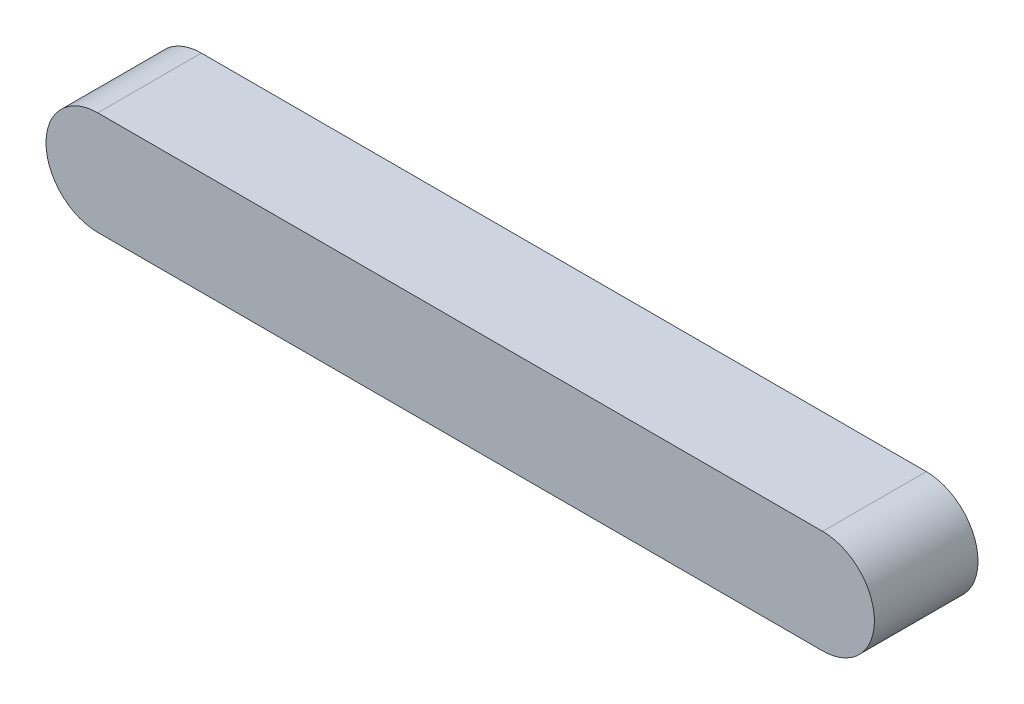
ISO-10303-21;
HEADER;
FILE_DESCRIPTION(('STEP AP214'),'2;1');
FILE_NAME('part.step','',(''),(''),'','','');
FILE_SCHEMA(('AUTOMOTIVE_DESIGN { 1 0 10303 214 1 1 1 1 }'));
ENDSEC;
DATA;
#1=APPLICATION_CONTEXT('core data for automotive mechanical design processes');
#2=APPLICATION_PROTOCOL_DEFINITION('international standard','automotive_design',2000,#1);
#3=PRODUCT_CONTEXT('',#1,'mechanical');
#4=PRODUCT('Part','Part','',(#3));
#5=PRODUCT_RELATED_PRODUCT_CATEGORY('part','',(#4));
#6=PRODUCT_DEFINITION_FORMATION('','',#4);
#7=PRODUCT_DEFINITION_CONTEXT('part definition',#1,'design');
#8=PRODUCT_DEFINITION('design','',#6,#7);
#9=PRODUCT_DEFINITION_SHAPE('','',#8);
#10=(LENGTH_UNIT() NAMED_UNIT(*) SI_UNIT(.MILLI.,.METRE.));
#11=(NAMED_UNIT(*) PLANE_ANGLE_UNIT() SI_UNIT($,.RADIAN.));
#12=(NAMED_UNIT(*) SI_UNIT($,.STERADIAN.) SOLID_ANGLE_UNIT());
#13=UNCERTAINTY_MEASURE_WITH_UNIT(LENGTH_MEASURE(1.E-05),#10,'distance_accuracy_value','');
#14=(GEOMETRIC_REPRESENTATION_CONTEXT(3) GLOBAL_UNCERTAINTY_ASSIGNED_CONTEXT((#13)) GLOBAL_UNIT_ASSIGNED_CONTEXT((#10,
#11,#12)) REPRESENTATION_CONTEXT('',''));
#15=CARTESIAN_POINT('',(0.,0.,0.));
#16=DIRECTION('',(0.,0.,1.));
#17=DIRECTION('',(1.,0.,0.));
#18=AXIS2_PLACEMENT_3D('',#15,#16,#17);
#19=CARTESIAN_POINT('',(-12.7,-3.175,1.5875));
#20=DIRECTION('',(0.,1.,0.));
#21=DIRECTION('',(0.,0.,1.));
#22=AXIS2_PLACEMENT_3D('',#19,#20,#21);
#23=PLANE('',#22);
#24=DIRECTION('',(0.,0.,1.));
#25=VECTOR('',#24,1.);
#26=CARTESIAN_POINT('',(11.1125,-3.175,-1.5875));
#27=LINE('',#26,#25);
#28=CARTESIAN_POINT('',(11.1125,-3.175,-1.5875));
#29=VERTEX_POINT('',#28);
#30=CARTESIAN_POINT('',(11.1125,-3.175,1.5875));
#31=VERTEX_POINT('',#30);
#32=EDGE_CURVE('E77',#29,#31,#27,.T.);
#33=ORIENTED_EDGE('',*,*,#32,.T.);
#34=DIRECTION('',(1.,0.,0.));
#35=VECTOR('',#34,1.);
#36=CARTESIAN_POINT('',(-12.7,-3.175,1.5875));
#37=LINE('',#36,#35);
#38=CARTESIAN_POINT('',(-11.1125,-3.175,1.5875));
#39=VERTEX_POINT('',#38);
#40=EDGE_CURVE('E44',#39,#31,#37,.T.);
#41=ORIENTED_EDGE('',*,*,#40,.F.);
#42=DIRECTION('',(0.,0.,1.));
#43=VECTOR('',#42,1.);
#44=CARTESIAN_POINT('',(-11.1125,-3.175,-1.5875));
#45=LINE('',#44,#43);
#46=CARTESIAN_POINT('',(-11.1125,-3.175,-1.5875));
#47=VERTEX_POINT('',#46);
#48=EDGE_CURVE('E85',#47,#39,#45,.T.);
#49=ORIENTED_EDGE('',*,*,#48,.F.);
#50=DIRECTION('',(-1.,0.,0.));
#51=VECTOR('',#50,1.);
#52=CARTESIAN_POINT('',(-12.7,-3.175,-1.5875));
#53=LINE('',#52,#51);
#54=EDGE_CURVE('E12',#29,#47,#53,.T.);
#55=ORIENTED_EDGE('',*,*,#54,.F.);
#56=EDGE_LOOP('',(#33,#41,#49,#55));
#57=FACE_BOUND('',#56,.T.);
#58=ADVANCED_FACE('F35',(#57),#23,.F.);
#59=CARTESIAN_POINT('',(-12.7,0.,1.5875));
#60=DIRECTION('',(0.,1.,0.));
#61=DIRECTION('',(0.,0.,1.));
#62=AXIS2_PLACEMENT_3D('',#59,#60,#61);
#63=PLANE('',#62);
#64=DIRECTION('',(1.,0.,0.));
#65=VECTOR('',#64,1.);
#66=CARTESIAN_POINT('',(-12.7,0.,1.5875));
#67=LINE('',#66,#65);
#68=CARTESIAN_POINT('',(-11.1125,0.,1.5875));
#69=VERTEX_POINT('',#68);
#70=CARTESIAN_POINT('',(11.1125,0.,1.5875));
#71=VERTEX_POINT('',#70);
#72=EDGE_CURVE('E84',#69,#71,#67,.T.);
#73=ORIENTED_EDGE('',*,*,#72,.T.);
#74=DIRECTION('',(0.,0.,1.));
#75=VECTOR('',#74,1.);
#76=CARTESIAN_POINT('',(11.1125,0.,-1.5875));
#77=LINE('',#76,#75);
#78=CARTESIAN_POINT('',(11.1125,0.,-1.5875));
#79=VERTEX_POINT('',#78);
#80=EDGE_CURVE('E97',#79,#71,#77,.T.);
#81=ORIENTED_EDGE('',*,*,#80,.F.);
#82=DIRECTION('',(-1.,0.,0.));
#83=VECTOR('',#82,1.);
#84=CARTESIAN_POINT('',(-12.7,0.,-1.5875));
#85=LINE('',#84,#83);
#86=CARTESIAN_POINT('',(-11.1125,0.,-1.5875));
#87=VERTEX_POINT('',#86);
#88=EDGE_CURVE('E39',#79,#87,#85,.T.);
#89=ORIENTED_EDGE('',*,*,#88,.T.);
#90=DIRECTION('',(0.,0.,1.));
#91=VECTOR('',#90,1.);
#92=CARTESIAN_POINT('',(-11.1125,0.,-1.5875));
#93=LINE('',#92,#91);
#94=EDGE_CURVE('E95',#87,#69,#93,.T.);
#95=ORIENTED_EDGE('',*,*,#94,.T.);
#96=EDGE_LOOP('',(#73,#81,#89,#95));
#97=FACE_BOUND('',#96,.T.);
#98=ADVANCED_FACE('F104',(#97),#63,.T.);
#99=CARTESIAN_POINT('',(-12.7,-3.175,-1.5875));
#100=DIRECTION('',(0.,0.,-1.));
#101=DIRECTION('',(-1.,0.,0.));
#102=AXIS2_PLACEMENT_3D('',#99,#100,#101);
#103=PLANE('',#102);
#104=CARTESIAN_POINT('',(11.1125,-1.5875,-1.5875));
#105=DIRECTION('',(0.,0.,-1.));
#106=DIRECTION('',(-1.,0.,0.));
#107=AXIS2_PLACEMENT_3D('',#104,#105,#106);
#108=CIRCLE('',#107,1.5875);
#109=EDGE_CURVE('E52',#79,#29,#108,.T.);
#110=ORIENTED_EDGE('',*,*,#109,.T.);
#111=ORIENTED_EDGE('',*,*,#54,.T.);
#112=CARTESIAN_POINT('',(-11.1125,-1.5875,-1.5875));
#113=DIRECTION('',(0.,0.,-1.));
#114=DIRECTION('',(-1.,0.,0.));
#115=AXIS2_PLACEMENT_3D('',#112,#113,#114);
#116=CIRCLE('',#115,1.5875);
#117=EDGE_CURVE('E92',#47,#87,#116,.T.);
#118=ORIENTED_EDGE('',*,*,#117,.T.);
#119=ORIENTED_EDGE('',*,*,#88,.F.);
#120=EDGE_LOOP('',(#110,#111,#118,#119));
#121=FACE_BOUND('',#120,.T.);
#122=ADVANCED_FACE('F89',(#121),#103,.T.);
#123=CARTESIAN_POINT('',(-12.7,-3.175,1.5875));
#124=DIRECTION('',(0.,0.,1.));
#125=DIRECTION('',(1.,0.,0.));
#126=AXIS2_PLACEMENT_3D('',#123,#124,#125);
#127=PLANE('',#126);
#128=CARTESIAN_POINT('',(11.1125,-1.5875,1.5875));
#129=DIRECTION('',(0.,0.,-1.));
#130=DIRECTION('',(-1.,0.,0.));
#131=AXIS2_PLACEMENT_3D('',#128,#129,#130);
#132=CIRCLE('',#131,1.5875);
#133=EDGE_CURVE('E79',#71,#31,#132,.T.);
#134=ORIENTED_EDGE('',*,*,#133,.F.);
#135=ORIENTED_EDGE('',*,*,#72,.F.);
#136=CARTESIAN_POINT('',(-11.1125,-1.5875,1.5875));
#137=DIRECTION('',(0.,0.,-1.));
#138=DIRECTION('',(-1.,0.,0.));
#139=AXIS2_PLACEMENT_3D('',#136,#137,#138);
#140=CIRCLE('',#139,1.5875);
#141=EDGE_CURVE('E60',#39,#69,#140,.T.);
#142=ORIENTED_EDGE('',*,*,#141,.F.);
#143=ORIENTED_EDGE('',*,*,#40,.T.);
#144=EDGE_LOOP('',(#134,#135,#142,#143));
#145=FACE_BOUND('',#144,.T.);
#146=ADVANCED_FACE('F37',(#145),#127,.T.);
#147=CARTESIAN_POINT('',(-11.1125,-1.5875,-1.5875));
#148=DIRECTION('',(0.,0.,1.));
#149=DIRECTION('',(1.,0.,0.));
#150=AXIS2_PLACEMENT_3D('',#147,#148,#149);
#151=CYLINDRICAL_SURFACE('',#150,1.5875);
#152=ORIENTED_EDGE('',*,*,#141,.T.);
#153=ORIENTED_EDGE('',*,*,#94,.F.);
#154=ORIENTED_EDGE('',*,*,#117,.F.);
#155=ORIENTED_EDGE('',*,*,#48,.T.);
#156=EDGE_LOOP('',(#152,#153,#154,#155));
#157=FACE_BOUND('',#156,.T.);
#158=ADVANCED_FACE('F108',(#157),#151,.T.);
#159=CARTESIAN_POINT('',(11.1125,-1.5875,-1.5875));
#160=DIRECTION('',(0.,0.,1.));
#161=DIRECTION('',(1.,0.,0.));
#162=AXIS2_PLACEMENT_3D('',#159,#160,#161);
#163=CYLINDRICAL_SURFACE('',#162,1.5875);
#164=ORIENTED_EDGE('',*,*,#133,.T.);
#165=ORIENTED_EDGE('',*,*,#32,.F.);
#166=ORIENTED_EDGE('',*,*,#109,.F.);
#167=ORIENTED_EDGE('',*,*,#80,.T.);
#168=EDGE_LOOP('',(#164,#165,#166,#167));
#169=FACE_BOUND('',#168,.T.);
#170=ADVANCED_FACE('F78',(#169),#163,.T.);
#171=CLOSED_SHELL('',(#58,#98,#122,#146,#158,#170));
#172=MANIFOLD_SOLID_BREP('B2',#171);
#173=ADVANCED_BREP_SHAPE_REPRESENTATION('',(#18,#172),#14);
#174=SHAPE_DEFINITION_REPRESENTATION(#9,#173);
ENDSEC;
END-ISO-10303-21;
